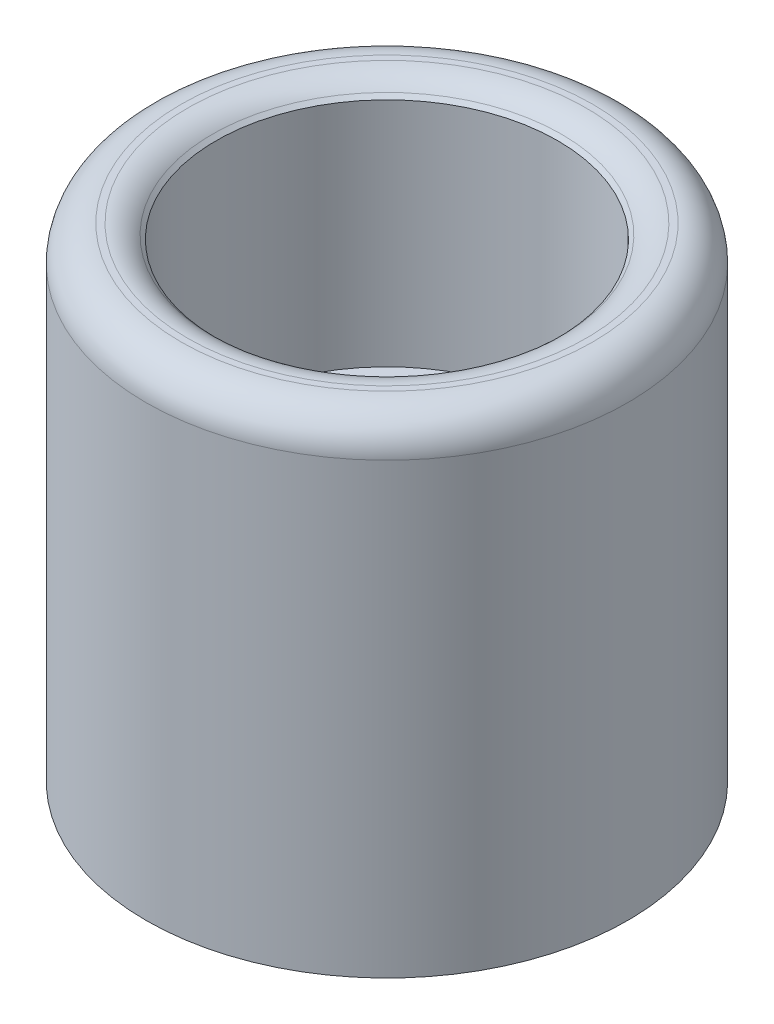
ISO-10303-21;
HEADER;
FILE_DESCRIPTION(('STEP AP214'),'2;1');
FILE_NAME('part.step','',(''),(''),'','','');
FILE_SCHEMA(('AUTOMOTIVE_DESIGN { 1 0 10303 214 1 1 1 1 }'));
ENDSEC;
DATA;
#1=APPLICATION_CONTEXT('core data for automotive mechanical design processes');
#2=APPLICATION_PROTOCOL_DEFINITION('international standard','automotive_design',2000,#1);
#3=PRODUCT_CONTEXT('',#1,'mechanical');
#4=PRODUCT('Part','Part','',(#3));
#5=PRODUCT_RELATED_PRODUCT_CATEGORY('part','',(#4));
#6=PRODUCT_DEFINITION_FORMATION('','',#4);
#7=PRODUCT_DEFINITION_CONTEXT('part definition',#1,'design');
#8=PRODUCT_DEFINITION('design','',#6,#7);
#9=PRODUCT_DEFINITION_SHAPE('','',#8);
#10=(LENGTH_UNIT() NAMED_UNIT(*) SI_UNIT(.MILLI.,.METRE.));
#11=(NAMED_UNIT(*) PLANE_ANGLE_UNIT() SI_UNIT($,.RADIAN.));
#12=(NAMED_UNIT(*) SI_UNIT($,.STERADIAN.) SOLID_ANGLE_UNIT());
#13=UNCERTAINTY_MEASURE_WITH_UNIT(LENGTH_MEASURE(1.E-05),#10,'distance_accuracy_value','');
#14=(GEOMETRIC_REPRESENTATION_CONTEXT(3) GLOBAL_UNCERTAINTY_ASSIGNED_CONTEXT((#13)) GLOBAL_UNIT_ASSIGNED_CONTEXT((#10,
#11,#12)) REPRESENTATION_CONTEXT('',''));
#15=CARTESIAN_POINT('',(0.,0.,0.));
#16=DIRECTION('',(0.,0.,1.));
#17=DIRECTION('',(1.,0.,0.));
#18=AXIS2_PLACEMENT_3D('',#15,#16,#17);
#19=CARTESIAN_POINT('',(-3.66617420935412,-25.571875,6.35));
#20=DIRECTION('',(0.866025403784439,0.,-0.5));
#21=DIRECTION('',(-0.5,0.,-0.866025403784439));
#22=AXIS2_PLACEMENT_3D('',#19,#20,#21);
#23=PLANE('',#22);
#24=DIRECTION('',(0.,1.,0.));
#25=VECTOR('',#24,1.);
#26=CARTESIAN_POINT('',(-3.66617420935412,-25.571875,6.35));
#27=LINE('',#26,#25);
#28=CARTESIAN_POINT('',(-3.66617420935412,-25.571875,6.35));
#29=VERTEX_POINT('',#28);
#30=CARTESIAN_POINT('',(-3.66617420935412,-18.428125,6.35));
#31=VERTEX_POINT('',#30);
#32=EDGE_CURVE('E167',#29,#31,#27,.T.);
#33=ORIENTED_EDGE('',*,*,#32,.F.);
#34=DIRECTION('',(-0.5,0.,-0.866025403784439));
#35=VECTOR('',#34,1.);
#36=CARTESIAN_POINT('',(-3.66617420935412,-25.571875,6.35));
#37=LINE('',#36,#35);
#38=CARTESIAN_POINT('',(-7.33234841870825,-25.571875,0.));
#39=VERTEX_POINT('',#38);
#40=EDGE_CURVE('E112',#29,#39,#37,.T.);
#41=ORIENTED_EDGE('',*,*,#40,.T.);
#42=DIRECTION('',(0.,1.,0.));
#43=VECTOR('',#42,1.);
#44=CARTESIAN_POINT('',(-7.33234841870825,-25.571875,0.));
#45=LINE('',#44,#43);
#46=CARTESIAN_POINT('',(-7.33234841870825,-18.428125,0.));
#47=VERTEX_POINT('',#46);
#48=EDGE_CURVE('E106',#39,#47,#45,.T.);
#49=ORIENTED_EDGE('',*,*,#48,.T.);
#50=DIRECTION('',(-0.5,0.,-0.866025403784439));
#51=VECTOR('',#50,1.);
#52=CARTESIAN_POINT('',(-3.66617420935412,-18.428125,6.35));
#53=LINE('',#52,#51);
#54=EDGE_CURVE('E109',#31,#47,#53,.T.);
#55=ORIENTED_EDGE('',*,*,#54,.F.);
#56=EDGE_LOOP('',(#33,#41,#49,#55));
#57=FACE_BOUND('',#56,.T.);
#58=ADVANCED_FACE('F49',(#57),#23,.T.);
#59=CARTESIAN_POINT('',(-7.33234841870825,-25.571875,0.));
#60=DIRECTION('',(0.866025403784438,0.,0.5));
#61=DIRECTION('',(0.5,0.,-0.866025403784439));
#62=AXIS2_PLACEMENT_3D('',#59,#60,#61);
#63=PLANE('',#62);
#64=ORIENTED_EDGE('',*,*,#48,.F.);
#65=DIRECTION('',(0.5,0.,-0.866025403784438));
#66=VECTOR('',#65,1.);
#67=CARTESIAN_POINT('',(-7.33234841870825,-25.571875,0.));
#68=LINE('',#67,#66);
#69=CARTESIAN_POINT('',(-3.66617420935412,-25.571875,-6.35));
#70=VERTEX_POINT('',#69);
#71=EDGE_CURVE('E154',#39,#70,#68,.T.);
#72=ORIENTED_EDGE('',*,*,#71,.T.);
#73=DIRECTION('',(0.,1.,0.));
#74=VECTOR('',#73,1.);
#75=CARTESIAN_POINT('',(-3.66617420935412,-25.571875,-6.35));
#76=LINE('',#75,#74);
#77=CARTESIAN_POINT('',(-3.66617420935412,-18.428125,-6.35));
#78=VERTEX_POINT('',#77);
#79=EDGE_CURVE('E116',#70,#78,#76,.T.);
#80=ORIENTED_EDGE('',*,*,#79,.T.);
#81=DIRECTION('',(0.5,0.,-0.866025403784438));
#82=VECTOR('',#81,1.);
#83=CARTESIAN_POINT('',(-7.33234841870825,-18.428125,0.));
#84=LINE('',#83,#82);
#85=EDGE_CURVE('E119',#47,#78,#84,.T.);
#86=ORIENTED_EDGE('',*,*,#85,.F.);
#87=EDGE_LOOP('',(#64,#72,#80,#86));
#88=FACE_BOUND('',#87,.T.);
#89=ADVANCED_FACE('F120',(#88),#63,.T.);
#90=CARTESIAN_POINT('',(-3.66617420935412,-25.571875,-6.35));
#91=DIRECTION('',(0.,0.,1.));
#92=DIRECTION('',(1.,0.,0.));
#93=AXIS2_PLACEMENT_3D('',#90,#91,#92);
#94=PLANE('',#93);
#95=ORIENTED_EDGE('',*,*,#79,.F.);
#96=DIRECTION('',(1.,0.,0.));
#97=VECTOR('',#96,1.);
#98=CARTESIAN_POINT('',(-3.66617420935412,-25.571875,-6.35));
#99=LINE('',#98,#97);
#100=CARTESIAN_POINT('',(3.66617420935412,-25.571875,-6.35));
#101=VERTEX_POINT('',#100);
#102=EDGE_CURVE('E157',#70,#101,#99,.T.);
#103=ORIENTED_EDGE('',*,*,#102,.T.);
#104=DIRECTION('',(0.,1.,0.));
#105=VECTOR('',#104,1.);
#106=CARTESIAN_POINT('',(3.66617420935412,-25.571875,-6.35));
#107=LINE('',#106,#105);
#108=CARTESIAN_POINT('',(3.66617420935412,-18.428125,-6.35));
#109=VERTEX_POINT('',#108);
#110=EDGE_CURVE('E176',#101,#109,#107,.T.);
#111=ORIENTED_EDGE('',*,*,#110,.T.);
#112=DIRECTION('',(1.,0.,0.));
#113=VECTOR('',#112,1.);
#114=CARTESIAN_POINT('',(-3.66617420935412,-18.428125,-6.35));
#115=LINE('',#114,#113);
#116=EDGE_CURVE('E126',#78,#109,#115,.T.);
#117=ORIENTED_EDGE('',*,*,#116,.F.);
#118=EDGE_LOOP('',(#95,#103,#111,#117));
#119=FACE_BOUND('',#118,.T.);
#120=ADVANCED_FACE('F230',(#119),#94,.T.);
#121=CARTESIAN_POINT('',(3.66617420935412,-25.571875,-6.35));
#122=DIRECTION('',(-0.866025403784439,0.,0.5));
#123=DIRECTION('',(0.5,0.,0.866025403784439));
#124=AXIS2_PLACEMENT_3D('',#121,#122,#123);
#125=PLANE('',#124);
#126=ORIENTED_EDGE('',*,*,#110,.F.);
#127=DIRECTION('',(0.5,0.,0.866025403784439));
#128=VECTOR('',#127,1.);
#129=CARTESIAN_POINT('',(3.66617420935412,-25.571875,-6.35));
#130=LINE('',#129,#128);
#131=CARTESIAN_POINT('',(7.33234841870825,-25.571875,0.));
#132=VERTEX_POINT('',#131);
#133=EDGE_CURVE('E160',#101,#132,#130,.T.);
#134=ORIENTED_EDGE('',*,*,#133,.T.);
#135=DIRECTION('',(0.,1.,0.));
#136=VECTOR('',#135,1.);
#137=CARTESIAN_POINT('',(7.33234841870825,-25.571875,0.));
#138=LINE('',#137,#136);
#139=CARTESIAN_POINT('',(7.33234841870825,-18.428125,0.));
#140=VERTEX_POINT('',#139);
#141=EDGE_CURVE('E173',#132,#140,#138,.T.);
#142=ORIENTED_EDGE('',*,*,#141,.T.);
#143=DIRECTION('',(0.5,0.,0.866025403784439));
#144=VECTOR('',#143,1.);
#145=CARTESIAN_POINT('',(3.66617420935412,-18.428125,-6.35));
#146=LINE('',#145,#144);
#147=EDGE_CURVE('E143',#109,#140,#146,.T.);
#148=ORIENTED_EDGE('',*,*,#147,.F.);
#149=EDGE_LOOP('',(#126,#134,#142,#148));
#150=FACE_BOUND('',#149,.T.);
#151=ADVANCED_FACE('F290',(#150),#125,.T.);
#152=CARTESIAN_POINT('',(7.33234841870825,-25.571875,0.));
#153=DIRECTION('',(-0.866025403784439,0.,-0.5));
#154=DIRECTION('',(-0.5,0.,0.866025403784439));
#155=AXIS2_PLACEMENT_3D('',#152,#153,#154);
#156=PLANE('',#155);
#157=ORIENTED_EDGE('',*,*,#141,.F.);
#158=DIRECTION('',(-0.5,0.,0.866025403784439));
#159=VECTOR('',#158,1.);
#160=CARTESIAN_POINT('',(7.33234841870825,-25.571875,0.));
#161=LINE('',#160,#159);
#162=CARTESIAN_POINT('',(3.66617420935412,-25.571875,6.35));
#163=VERTEX_POINT('',#162);
#164=EDGE_CURVE('E74',#132,#163,#161,.T.);
#165=ORIENTED_EDGE('',*,*,#164,.T.);
#166=DIRECTION('',(0.,1.,0.));
#167=VECTOR('',#166,1.);
#168=CARTESIAN_POINT('',(3.66617420935412,-25.571875,6.35));
#169=LINE('',#168,#167);
#170=CARTESIAN_POINT('',(3.66617420935412,-18.428125,6.35));
#171=VERTEX_POINT('',#170);
#172=EDGE_CURVE('E170',#163,#171,#169,.T.);
#173=ORIENTED_EDGE('',*,*,#172,.T.);
#174=DIRECTION('',(-0.5,0.,0.866025403784439));
#175=VECTOR('',#174,1.);
#176=CARTESIAN_POINT('',(7.33234841870825,-18.428125,0.));
#177=LINE('',#176,#175);
#178=EDGE_CURVE('E147',#140,#171,#177,.T.);
#179=ORIENTED_EDGE('',*,*,#178,.F.);
#180=EDGE_LOOP('',(#157,#165,#173,#179));
#181=FACE_BOUND('',#180,.T.);
#182=ADVANCED_FACE('F299',(#181),#156,.T.);
#183=CARTESIAN_POINT('',(3.66617420935412,-25.571875,6.35));
#184=DIRECTION('',(0.,0.,-1.));
#185=DIRECTION('',(-1.,0.,0.));
#186=AXIS2_PLACEMENT_3D('',#183,#184,#185);
#187=PLANE('',#186);
#188=ORIENTED_EDGE('',*,*,#172,.F.);
#189=DIRECTION('',(-1.,0.,0.));
#190=VECTOR('',#189,1.);
#191=CARTESIAN_POINT('',(3.66617420935412,-25.571875,6.35));
#192=LINE('',#191,#190);
#193=EDGE_CURVE('E66',#163,#29,#192,.T.);
#194=ORIENTED_EDGE('',*,*,#193,.T.);
#195=ORIENTED_EDGE('',*,*,#32,.T.);
#196=DIRECTION('',(-1.,0.,0.));
#197=VECTOR('',#196,1.);
#198=CARTESIAN_POINT('',(3.66617420935412,-18.428125,6.35));
#199=LINE('',#198,#197);
#200=EDGE_CURVE('E131',#171,#31,#199,.T.);
#201=ORIENTED_EDGE('',*,*,#200,.F.);
#202=EDGE_LOOP('',(#188,#194,#195,#201));
#203=FACE_BOUND('',#202,.T.);
#204=ADVANCED_FACE('F309',(#203),#187,.T.);
#205=CARTESIAN_POINT('',(0.,-25.571875,0.));
#206=DIRECTION('',(0.,-1.,0.));
#207=DIRECTION('',(0.,0.,-1.));
#208=AXIS2_PLACEMENT_3D('',#205,#206,#207);
#209=PLANE('',#208);
#210=CARTESIAN_POINT('',(0.,-25.571875,0.));
#211=DIRECTION('',(0.,-1.,0.));
#212=DIRECTION('',(0.,0.,-1.));
#213=AXIS2_PLACEMENT_3D('',#210,#211,#212);
#214=CIRCLE('',#213,4.99999999999999);
#215=CARTESIAN_POINT('',(0.,-25.571875,-4.99999999999999));
#216=VERTEX_POINT('',#215);
#217=EDGE_CURVE('E137',#216,#216,#214,.T.);
#218=ORIENTED_EDGE('',*,*,#217,.T.);
#219=EDGE_LOOP('',(#218));
#220=FACE_BOUND('',#219,.T.);
#221=ORIENTED_EDGE('',*,*,#40,.F.);
#222=ORIENTED_EDGE('',*,*,#193,.F.);
#223=ORIENTED_EDGE('',*,*,#164,.F.);
#224=ORIENTED_EDGE('',*,*,#133,.F.);
#225=ORIENTED_EDGE('',*,*,#102,.F.);
#226=ORIENTED_EDGE('',*,*,#71,.F.);
#227=EDGE_LOOP('',(#221,#222,#223,#224,#225,#226));
#228=FACE_BOUND('',#227,.T.);
#229=ADVANCED_FACE('F318',(#220,#228),#209,.F.);
#230=CARTESIAN_POINT('',(0.,-18.428125,0.));
#231=DIRECTION('',(0.,-1.,0.));
#232=DIRECTION('',(0.,0.,-1.));
#233=AXIS2_PLACEMENT_3D('',#230,#231,#232);
#234=PLANE('',#233);
#235=CARTESIAN_POINT('',(0.,-18.428125,0.));
#236=DIRECTION('',(0.,-1.,0.));
#237=DIRECTION('',(0.,0.,-1.));
#238=AXIS2_PLACEMENT_3D('',#235,#236,#237);
#239=CIRCLE('',#238,4.99999999999999);
#240=CARTESIAN_POINT('',(0.,-18.428125,-4.99999999999999));
#241=VERTEX_POINT('',#240);
#242=EDGE_CURVE('E53',#241,#241,#239,.T.);
#243=ORIENTED_EDGE('',*,*,#242,.F.);
#244=EDGE_LOOP('',(#243));
#245=FACE_BOUND('',#244,.T.);
#246=ORIENTED_EDGE('',*,*,#54,.T.);
#247=ORIENTED_EDGE('',*,*,#85,.T.);
#248=ORIENTED_EDGE('',*,*,#116,.T.);
#249=ORIENTED_EDGE('',*,*,#147,.T.);
#250=ORIENTED_EDGE('',*,*,#178,.T.);
#251=ORIENTED_EDGE('',*,*,#200,.T.);
#252=EDGE_LOOP('',(#246,#247,#248,#249,#250,#251));
#253=FACE_BOUND('',#252,.T.);
#254=ADVANCED_FACE('F128',(#245,#253),#234,.T.);
#255=CARTESIAN_POINT('',(0.,-34.,0.));
#256=DIRECTION('',(0.,-1.,0.));
#257=DIRECTION('',(0.,0.,-1.));
#258=AXIS2_PLACEMENT_3D('',#255,#256,#257);
#259=CYLINDRICAL_SURFACE('',#258,4.99999999999999);
#260=CARTESIAN_POINT('',(0.,0.,0.));
#261=DIRECTION('',(0.,1.,0.));
#262=DIRECTION('',(0.,0.,1.));
#263=AXIS2_PLACEMENT_3D('',#260,#261,#262);
#264=CIRCLE('',#263,4.99999999999999);
#265=CARTESIAN_POINT('',(0.,0.,4.99999999999999));
#266=VERTEX_POINT('',#265);
#267=EDGE_CURVE('E133',#266,#266,#264,.T.);
#268=ORIENTED_EDGE('',*,*,#267,.T.);
#269=EDGE_LOOP('',(#268));
#270=FACE_BOUND('',#269,.T.);
#271=ORIENTED_EDGE('',*,*,#242,.T.);
#272=EDGE_LOOP('',(#271));
#273=FACE_BOUND('',#272,.T.);
#274=ADVANCED_FACE('F336',(#270,#273),#259,.F.);
#275=CARTESIAN_POINT('',(0.,-34.,0.));
#276=DIRECTION('',(0.,-1.,0.));
#277=DIRECTION('',(0.,0.,-1.));
#278=AXIS2_PLACEMENT_3D('',#275,#276,#277);
#279=CIRCLE('',#278,4.99999999999999);
#280=CARTESIAN_POINT('',(0.,-34.,-4.99999999999999));
#281=VERTEX_POINT('',#280);
#282=EDGE_CURVE('E399',#281,#281,#279,.T.);
#283=ORIENTED_EDGE('',*,*,#282,.T.);
#284=EDGE_LOOP('',(#283));
#285=FACE_BOUND('',#284,.T.);
#286=ORIENTED_EDGE('',*,*,#217,.F.);
#287=EDGE_LOOP('',(#286));
#288=FACE_BOUND('',#287,.T.);
#289=ADVANCED_FACE('F216',(#285,#288),#259,.F.);
#290=CARTESIAN_POINT('',(0.,35.,0.));
#291=DIRECTION('',(0.,1.,0.));
#292=DIRECTION('',(0.,0.,1.));
#293=AXIS2_PLACEMENT_3D('',#290,#291,#292);
#294=PLANE('',#293);
#295=CARTESIAN_POINT('',(0.,35.,0.));
#296=DIRECTION('',(0.,1.,0.));
#297=DIRECTION('',(0.,0.,1.));
#298=AXIS2_PLACEMENT_3D('',#295,#296,#297);
#299=CIRCLE('',#298,29.384);
#300=CARTESIAN_POINT('',(0.,35.,29.384));
#301=VERTEX_POINT('',#300);
#302=EDGE_CURVE('E196',#301,#301,#299,.T.);
#303=ORIENTED_EDGE('',*,*,#302,.T.);
#304=EDGE_LOOP('',(#303));
#305=FACE_BOUND('',#304,.T.);
#306=CARTESIAN_POINT('',(0.,35.,0.));
#307=DIRECTION('',(0.,1.,0.));
#308=DIRECTION('',(0.,0.,1.));
#309=AXIS2_PLACEMENT_3D('',#306,#307,#308);
#310=CIRCLE('',#309,28.4550678118655);
#311=CARTESIAN_POINT('',(0.,35.,28.4550678118655));
#312=VERTEX_POINT('',#311);
#313=EDGE_CURVE('E192',#312,#312,#310,.F.);
#314=ORIENTED_EDGE('',*,*,#313,.T.);
#315=EDGE_LOOP('',(#314));
#316=FACE_BOUND('',#315,.T.);
#317=ADVANCED_FACE('F213',(#305,#316),#294,.T.);
#318=CARTESIAN_POINT('',(0.,35.,0.));
#319=DIRECTION('',(0.,-1.,0.));
#320=DIRECTION('',(0.,0.,-1.));
#321=AXIS2_PLACEMENT_3D('',#318,#319,#320);
#322=CYLINDRICAL_SURFACE('',#321,34.384);
#323=CARTESIAN_POINT('',(0.,30.,0.));
#324=DIRECTION('',(0.,1.,0.));
#325=DIRECTION('',(0.,0.,1.));
#326=AXIS2_PLACEMENT_3D('',#323,#324,#325);
#327=CIRCLE('',#326,34.384);
#328=CARTESIAN_POINT('',(0.,30.,34.384));
#329=VERTEX_POINT('',#328);
#330=EDGE_CURVE('E59',#329,#329,#327,.F.);
#331=ORIENTED_EDGE('',*,*,#330,.T.);
#332=EDGE_LOOP('',(#331));
#333=FACE_BOUND('',#332,.T.);
#334=CARTESIAN_POINT('',(0.,-34.,0.));
#335=DIRECTION('',(0.,1.,0.));
#336=DIRECTION('',(0.,0.,1.));
#337=AXIS2_PLACEMENT_3D('',#334,#335,#336);
#338=CIRCLE('',#337,34.384);
#339=CARTESIAN_POINT('',(0.,-34.,34.384));
#340=VERTEX_POINT('',#339);
#341=EDGE_CURVE('E115',#340,#340,#338,.T.);
#342=ORIENTED_EDGE('',*,*,#341,.T.);
#343=EDGE_LOOP('',(#342));
#344=FACE_BOUND('',#343,.T.);
#345=ADVANCED_FACE('F204',(#333,#344),#322,.T.);
#346=CARTESIAN_POINT('',(0.,35.,0.));
#347=DIRECTION('',(0.,-1.,0.));
#348=DIRECTION('',(0.,0.,-1.));
#349=AXIS2_PLACEMENT_3D('',#346,#347,#348);
#350=CYLINDRICAL_SURFACE('',#349,24.384);
#351=CARTESIAN_POINT('',(0.,33.,0.));
#352=DIRECTION('',(0.,1.,0.));
#353=DIRECTION('',(0.,0.,1.));
#354=AXIS2_PLACEMENT_3D('',#351,#352,#353);
#355=CIRCLE('',#354,24.384);
#356=CARTESIAN_POINT('',(0.,33.,24.384));
#357=VERTEX_POINT('',#356);
#358=EDGE_CURVE('E188',#357,#357,#355,.T.);
#359=ORIENTED_EDGE('',*,*,#358,.T.);
#360=EDGE_LOOP('',(#359));
#361=FACE_BOUND('',#360,.T.);
#362=CARTESIAN_POINT('',(0.,0.,0.));
#363=DIRECTION('',(0.,1.,0.));
#364=DIRECTION('',(0.,0.,1.));
#365=AXIS2_PLACEMENT_3D('',#362,#363,#364);
#366=CIRCLE('',#365,24.384);
#367=CARTESIAN_POINT('',(0.,0.,24.384));
#368=VERTEX_POINT('',#367);
#369=EDGE_CURVE('E184',#368,#368,#366,.T.);
#370=ORIENTED_EDGE('',*,*,#369,.F.);
#371=EDGE_LOOP('',(#370));
#372=FACE_BOUND('',#371,.T.);
#373=ADVANCED_FACE('F241',(#361,#372),#350,.F.);
#374=CARTESIAN_POINT('',(0.,0.,0.));
#375=DIRECTION('',(0.,1.,0.));
#376=DIRECTION('',(0.,0.,1.));
#377=AXIS2_PLACEMENT_3D('',#374,#375,#376);
#378=PLANE('',#377);
#379=ORIENTED_EDGE('',*,*,#267,.F.);
#380=EDGE_LOOP('',(#379));
#381=FACE_BOUND('',#380,.T.);
#382=ORIENTED_EDGE('',*,*,#369,.T.);
#383=EDGE_LOOP('',(#382));
#384=FACE_BOUND('',#383,.T.);
#385=ADVANCED_FACE('F237',(#381,#384),#378,.T.);
#386=CARTESIAN_POINT('',(0.,-34.,0.));
#387=DIRECTION('',(0.,1.,0.));
#388=DIRECTION('',(0.,0.,1.));
#389=AXIS2_PLACEMENT_3D('',#386,#387,#388);
#390=PLANE('',#389);
#391=ORIENTED_EDGE('',*,*,#282,.F.);
#392=EDGE_LOOP('',(#391));
#393=FACE_BOUND('',#392,.T.);
#394=ORIENTED_EDGE('',*,*,#341,.F.);
#395=EDGE_LOOP('',(#394));
#396=FACE_BOUND('',#395,.T.);
#397=ADVANCED_FACE('F234',(#393,#396),#390,.F.);
#398=CARTESIAN_POINT('',(0.,33.,0.));
#399=DIRECTION('',(0.,1.,0.));
#400=DIRECTION('',(0.,0.,1.));
#401=AXIS2_PLACEMENT_3D('',#398,#399,#400);
#402=CONICAL_SURFACE('',#401,24.384,0.785398163397451);
#403=CARTESIAN_POINT('',(0.,33.5355339059328,0.));
#404=DIRECTION('',(0.,-1.,0.));
#405=DIRECTION('',(0.,0.,-1.));
#406=AXIS2_PLACEMENT_3D('',#403,#404,#405);
#407=CIRCLE('',#406,24.9195339059328);
#408=CARTESIAN_POINT('',(0.,33.5355339059328,-24.9195339059328));
#409=VERTEX_POINT('',#408);
#410=EDGE_CURVE('E12',#409,#409,#407,.F.);
#411=ORIENTED_EDGE('',*,*,#410,.T.);
#412=EDGE_LOOP('',(#411));
#413=FACE_BOUND('',#412,.T.);
#414=ORIENTED_EDGE('',*,*,#358,.F.);
#415=EDGE_LOOP('',(#414));
#416=FACE_BOUND('',#415,.T.);
#417=ADVANCED_FACE('F210',(#413,#416),#402,.F.);
#418=CARTESIAN_POINT('',(0.,30.,0.));
#419=DIRECTION('',(0.,1.,0.));
#420=DIRECTION('',(0.,0.,1.));
#421=AXIS2_PLACEMENT_3D('',#418,#419,#420);
#422=TOROIDAL_SURFACE('',#421,29.384,5.);
#423=ORIENTED_EDGE('',*,*,#330,.F.);
#424=EDGE_LOOP('',(#423));
#425=FACE_BOUND('',#424,.T.);
#426=ORIENTED_EDGE('',*,*,#302,.F.);
#427=EDGE_LOOP('',(#426));
#428=FACE_BOUND('',#427,.T.);
#429=ADVANCED_FACE('F207',(#425,#428),#422,.T.);
#430=CARTESIAN_POINT('',(0.,30.,0.));
#431=DIRECTION('',(0.,1.,0.));
#432=DIRECTION('',(0.,0.,1.));
#433=AXIS2_PLACEMENT_3D('',#430,#431,#432);
#434=TOROIDAL_SURFACE('',#433,28.4550678118655,5.);
#435=ORIENTED_EDGE('',*,*,#410,.F.);
#436=EDGE_LOOP('',(#435));
#437=FACE_BOUND('',#436,.T.);
#438=ORIENTED_EDGE('',*,*,#313,.F.);
#439=EDGE_LOOP('',(#438));
#440=FACE_BOUND('',#439,.T.);
#441=ADVANCED_FACE('F51',(#437,#440),#434,.T.);
#442=CLOSED_SHELL('',(#58,#89,#120,#151,#182,#204,#229,#254,#274,#289,#317,#345,#373,#385,#397,
#417,#429,#441));
#443=MANIFOLD_SOLID_BREP('B2',#442);
#444=ADVANCED_BREP_SHAPE_REPRESENTATION('',(#18,#443),#14);
#445=SHAPE_DEFINITION_REPRESENTATION(#9,#444);
ENDSEC;
END-ISO-10303-21;
